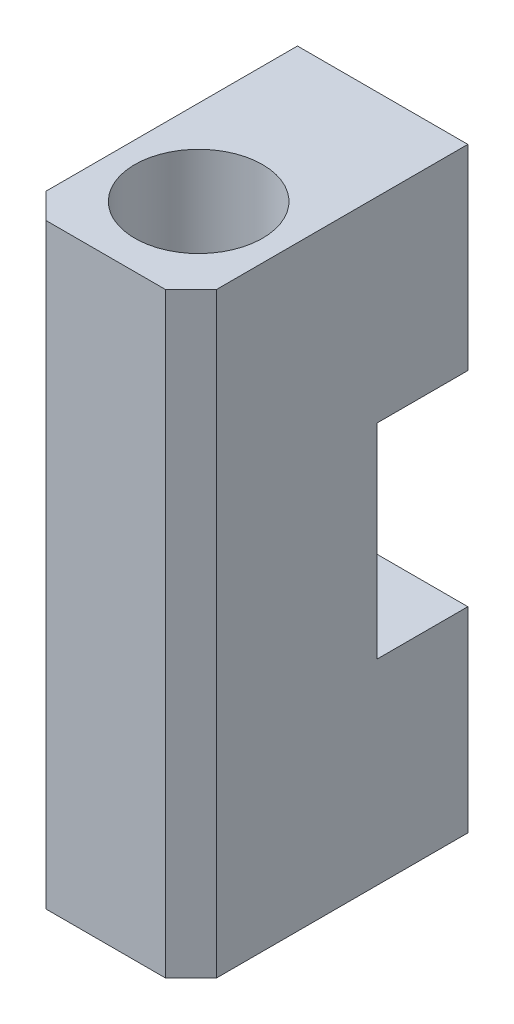
ISO-10303-21;
HEADER;
FILE_DESCRIPTION(('STEP AP214'),'2;1');
FILE_NAME('part.step','',(''),(''),'','','');
FILE_SCHEMA(('AUTOMOTIVE_DESIGN { 1 0 10303 214 1 1 1 1 }'));
ENDSEC;
DATA;
#1=APPLICATION_CONTEXT('core data for automotive mechanical design processes');
#2=APPLICATION_PROTOCOL_DEFINITION('international standard','automotive_design',2000,#1);
#3=PRODUCT_CONTEXT('',#1,'mechanical');
#4=PRODUCT('Part','Part','',(#3));
#5=PRODUCT_RELATED_PRODUCT_CATEGORY('part','',(#4));
#6=PRODUCT_DEFINITION_FORMATION('','',#4);
#7=PRODUCT_DEFINITION_CONTEXT('part definition',#1,'design');
#8=PRODUCT_DEFINITION('design','',#6,#7);
#9=PRODUCT_DEFINITION_SHAPE('','',#8);
#10=(LENGTH_UNIT() NAMED_UNIT(*) SI_UNIT(.MILLI.,.METRE.));
#11=(NAMED_UNIT(*) PLANE_ANGLE_UNIT() SI_UNIT($,.RADIAN.));
#12=(NAMED_UNIT(*) SI_UNIT($,.STERADIAN.) SOLID_ANGLE_UNIT());
#13=UNCERTAINTY_MEASURE_WITH_UNIT(LENGTH_MEASURE(1.E-05),#10,'distance_accuracy_value','');
#14=(GEOMETRIC_REPRESENTATION_CONTEXT(3) GLOBAL_UNCERTAINTY_ASSIGNED_CONTEXT((#13)) GLOBAL_UNIT_ASSIGNED_CONTEXT((#10,
#11,#12)) REPRESENTATION_CONTEXT('',''));
#15=CARTESIAN_POINT('',(0.,0.,0.));
#16=DIRECTION('',(0.,0.,1.));
#17=DIRECTION('',(1.,0.,0.));
#18=AXIS2_PLACEMENT_3D('',#15,#16,#17);
#19=CARTESIAN_POINT('',(0.,0.,-32.5));
#20=DIRECTION('',(0.,0.,-1.));
#21=DIRECTION('',(-1.,0.,0.));
#22=AXIS2_PLACEMENT_3D('',#19,#20,#21);
#23=PLANE('',#22);
#24=DIRECTION('',(1.,0.,0.));
#25=VECTOR('',#24,1.);
#26=CARTESIAN_POINT('',(0.,47.,-32.5));
#27=LINE('',#26,#25);
#28=CARTESIAN_POINT('',(0.,47.,-32.5));
#29=VERTEX_POINT('',#28);
#30=CARTESIAN_POINT('',(20.,47.,-32.5));
#31=VERTEX_POINT('',#30);
#32=EDGE_CURVE('E41',#29,#31,#27,.T.);
#33=ORIENTED_EDGE('',*,*,#32,.F.);
#34=DIRECTION('',(0.,-1.,0.));
#35=VECTOR('',#34,1.);
#36=CARTESIAN_POINT('',(0.,0.,-32.5));
#37=LINE('',#36,#35);
#38=CARTESIAN_POINT('',(0.,70.,-32.5));
#39=VERTEX_POINT('',#38);
#40=EDGE_CURVE('E140',#39,#29,#37,.T.);
#41=ORIENTED_EDGE('',*,*,#40,.F.);
#42=DIRECTION('',(-1.,0.,0.));
#43=VECTOR('',#42,1.);
#44=CARTESIAN_POINT('',(0.,70.,-32.5));
#45=LINE('',#44,#43);
#46=CARTESIAN_POINT('',(20.,70.,-32.5));
#47=VERTEX_POINT('',#46);
#48=EDGE_CURVE('E155',#47,#39,#45,.T.);
#49=ORIENTED_EDGE('',*,*,#48,.F.);
#50=DIRECTION('',(0.,1.,0.));
#51=VECTOR('',#50,1.);
#52=CARTESIAN_POINT('',(20.,0.,-32.5));
#53=LINE('',#52,#51);
#54=EDGE_CURVE('E152',#31,#47,#53,.T.);
#55=ORIENTED_EDGE('',*,*,#54,.F.);
#56=EDGE_LOOP('',(#33,#41,#49,#55));
#57=FACE_BOUND('',#56,.T.);
#58=CARTESIAN_POINT('',(10.,64.,-32.5));
#59=DIRECTION('',(0.,0.,-1.));
#60=DIRECTION('',(-1.,0.,0.));
#61=AXIS2_PLACEMENT_3D('',#58,#59,#60);
#62=CIRCLE('',#61,2.);
#63=CARTESIAN_POINT('',(8.00000000000001,64.,-32.5));
#64=VERTEX_POINT('',#63);
#65=EDGE_CURVE('E231',#64,#64,#62,.T.);
#66=ORIENTED_EDGE('',*,*,#65,.F.);
#67=EDGE_LOOP('',(#66));
#68=FACE_BOUND('',#67,.T.);
#69=ADVANCED_FACE('F33',(#57,#68),#23,.T.);
#70=CARTESIAN_POINT('',(0.,0.,-32.5));
#71=DIRECTION('',(-1.,0.,0.));
#72=DIRECTION('',(0.,0.,1.));
#73=AXIS2_PLACEMENT_3D('',#70,#71,#72);
#74=PLANE('',#73);
#75=DIRECTION('',(0.,0.,-1.));
#76=VECTOR('',#75,1.);
#77=CARTESIAN_POINT('',(0.,47.,-32.5));
#78=LINE('',#77,#76);
#79=CARTESIAN_POINT('',(0.,47.,-21.8540067878814));
#80=VERTEX_POINT('',#79);
#81=EDGE_CURVE('E192',#80,#29,#78,.T.);
#82=ORIENTED_EDGE('',*,*,#81,.F.);
#83=DIRECTION('',(0.,1.,0.));
#84=VECTOR('',#83,1.);
#85=CARTESIAN_POINT('',(0.,47.,-21.8540067878814));
#86=LINE('',#85,#84);
#87=CARTESIAN_POINT('',(0.,23.,-21.8540067878814));
#88=VERTEX_POINT('',#87);
#89=EDGE_CURVE('E133',#88,#80,#86,.T.);
#90=ORIENTED_EDGE('',*,*,#89,.F.);
#91=DIRECTION('',(0.,0.,1.));
#92=VECTOR('',#91,1.);
#93=CARTESIAN_POINT('',(0.,23.,-32.5));
#94=LINE('',#93,#92);
#95=CARTESIAN_POINT('',(0.,23.,-32.5));
#96=VERTEX_POINT('',#95);
#97=EDGE_CURVE('E118',#96,#88,#94,.T.);
#98=ORIENTED_EDGE('',*,*,#97,.F.);
#99=CARTESIAN_POINT('',(0.,0.,-32.5));
#100=VERTEX_POINT('',#99);
#101=EDGE_CURVE('E130',#96,#100,#37,.T.);
#102=ORIENTED_EDGE('',*,*,#101,.T.);
#103=DIRECTION('',(0.,0.,1.));
#104=VECTOR('',#103,1.);
#105=CARTESIAN_POINT('',(0.,0.,-32.5));
#106=LINE('',#105,#104);
#107=CARTESIAN_POINT('',(0.,0.,-3.00000000000002));
#108=VERTEX_POINT('',#107);
#109=EDGE_CURVE('E158',#100,#108,#106,.T.);
#110=ORIENTED_EDGE('',*,*,#109,.T.);
#111=DIRECTION('',(0.,1.,0.));
#112=VECTOR('',#111,1.);
#113=CARTESIAN_POINT('',(0.,70.,-3.00000000000002));
#114=LINE('',#113,#112);
#115=CARTESIAN_POINT('',(0.,70.,-3.00000000000002));
#116=VERTEX_POINT('',#115);
#117=EDGE_CURVE('E181',#108,#116,#114,.T.);
#118=ORIENTED_EDGE('',*,*,#117,.T.);
#119=DIRECTION('',(0.,0.,1.));
#120=VECTOR('',#119,1.);
#121=CARTESIAN_POINT('',(0.,70.,-32.5));
#122=LINE('',#121,#120);
#123=EDGE_CURVE('E162',#39,#116,#122,.T.);
#124=ORIENTED_EDGE('',*,*,#123,.F.);
#125=ORIENTED_EDGE('',*,*,#40,.T.);
#126=EDGE_LOOP('',(#82,#90,#98,#102,#110,#118,#124,#125));
#127=FACE_BOUND('',#126,.T.);
#128=ADVANCED_FACE('F128',(#127),#74,.T.);
#129=CARTESIAN_POINT('',(0.,70.,-32.5));
#130=DIRECTION('',(0.,1.,0.));
#131=DIRECTION('',(0.,0.,1.));
#132=AXIS2_PLACEMENT_3D('',#129,#130,#131);
#133=PLANE('',#132);
#134=CARTESIAN_POINT('',(10.,70.,-10.9));
#135=DIRECTION('',(0.,-1.,0.));
#136=DIRECTION('',(0.,0.,-1.));
#137=AXIS2_PLACEMENT_3D('',#134,#135,#136);
#138=CIRCLE('',#137,7.49999999999999);
#139=CARTESIAN_POINT('',(10.,70.,-18.4));
#140=VERTEX_POINT('',#139);
#141=EDGE_CURVE('E160',#140,#140,#138,.T.);
#142=ORIENTED_EDGE('',*,*,#141,.T.);
#143=EDGE_LOOP('',(#142));
#144=FACE_BOUND('',#143,.T.);
#145=ORIENTED_EDGE('',*,*,#123,.T.);
#146=DIRECTION('',(0.707106781186547,0.,0.707106781186548));
#147=VECTOR('',#146,1.);
#148=CARTESIAN_POINT('',(-14.75,70.,-17.75));
#149=LINE('',#148,#147);
#150=CARTESIAN_POINT('',(3.00000000000001,70.,0.));
#151=VERTEX_POINT('',#150);
#152=EDGE_CURVE('E184',#116,#151,#149,.T.);
#153=ORIENTED_EDGE('',*,*,#152,.T.);
#154=DIRECTION('',(-1.,0.,0.));
#155=VECTOR('',#154,1.);
#156=CARTESIAN_POINT('',(0.,70.,0.));
#157=LINE('',#156,#155);
#158=CARTESIAN_POINT('',(17.,70.,0.));
#159=VERTEX_POINT('',#158);
#160=EDGE_CURVE('E141',#159,#151,#157,.T.);
#161=ORIENTED_EDGE('',*,*,#160,.F.);
#162=DIRECTION('',(0.707106781186547,0.,-0.707106781186548));
#163=VECTOR('',#162,1.);
#164=CARTESIAN_POINT('',(24.75,70.,-7.75000000000005));
#165=LINE('',#164,#163);
#166=CARTESIAN_POINT('',(20.,70.,-3.00000000000002));
#167=VERTEX_POINT('',#166);
#168=EDGE_CURVE('E56',#159,#167,#165,.T.);
#169=ORIENTED_EDGE('',*,*,#168,.T.);
#170=DIRECTION('',(0.,0.,1.));
#171=VECTOR('',#170,1.);
#172=CARTESIAN_POINT('',(20.,70.,-32.5));
#173=LINE('',#172,#171);
#174=EDGE_CURVE('E166',#47,#167,#173,.T.);
#175=ORIENTED_EDGE('',*,*,#174,.F.);
#176=ORIENTED_EDGE('',*,*,#48,.T.);
#177=EDGE_LOOP('',(#145,#153,#161,#169,#175,#176));
#178=FACE_BOUND('',#177,.T.);
#179=ADVANCED_FACE('F203',(#144,#178),#133,.T.);
#180=CARTESIAN_POINT('',(20.,0.,-32.5));
#181=DIRECTION('',(1.,0.,0.));
#182=DIRECTION('',(0.,0.,-1.));
#183=AXIS2_PLACEMENT_3D('',#180,#181,#182);
#184=PLANE('',#183);
#185=DIRECTION('',(0.,0.,1.));
#186=VECTOR('',#185,1.);
#187=CARTESIAN_POINT('',(20.,47.,-32.5));
#188=LINE('',#187,#186);
#189=CARTESIAN_POINT('',(20.,47.,-21.8540067878814));
#190=VERTEX_POINT('',#189);
#191=EDGE_CURVE('E190',#31,#190,#188,.T.);
#192=ORIENTED_EDGE('',*,*,#191,.F.);
#193=ORIENTED_EDGE('',*,*,#54,.T.);
#194=ORIENTED_EDGE('',*,*,#174,.T.);
#195=DIRECTION('',(0.,-1.,0.));
#196=VECTOR('',#195,1.);
#197=CARTESIAN_POINT('',(20.,0.,-3.00000000000002));
#198=LINE('',#197,#196);
#199=CARTESIAN_POINT('',(20.,0.,-3.00000000000002));
#200=VERTEX_POINT('',#199);
#201=EDGE_CURVE('E124',#167,#200,#198,.T.);
#202=ORIENTED_EDGE('',*,*,#201,.T.);
#203=DIRECTION('',(0.,0.,1.));
#204=VECTOR('',#203,1.);
#205=CARTESIAN_POINT('',(20.,0.,-32.5));
#206=LINE('',#205,#204);
#207=CARTESIAN_POINT('',(20.,0.,-32.5));
#208=VERTEX_POINT('',#207);
#209=EDGE_CURVE('E168',#208,#200,#206,.T.);
#210=ORIENTED_EDGE('',*,*,#209,.F.);
#211=CARTESIAN_POINT('',(20.,23.,-32.5));
#212=VERTEX_POINT('',#211);
#213=EDGE_CURVE('E153',#208,#212,#53,.T.);
#214=ORIENTED_EDGE('',*,*,#213,.T.);
#215=DIRECTION('',(0.,0.,-1.));
#216=VECTOR('',#215,1.);
#217=CARTESIAN_POINT('',(20.,23.,-32.5));
#218=LINE('',#217,#216);
#219=CARTESIAN_POINT('',(20.,23.,-21.8540067878814));
#220=VERTEX_POINT('',#219);
#221=EDGE_CURVE('E48',#220,#212,#218,.T.);
#222=ORIENTED_EDGE('',*,*,#221,.F.);
#223=DIRECTION('',(0.,-1.,0.));
#224=VECTOR('',#223,1.);
#225=CARTESIAN_POINT('',(20.,0.,-21.8540067878814));
#226=LINE('',#225,#224);
#227=EDGE_CURVE('E11',#190,#220,#226,.T.);
#228=ORIENTED_EDGE('',*,*,#227,.F.);
#229=EDGE_LOOP('',(#192,#193,#194,#202,#210,#214,#222,#228));
#230=FACE_BOUND('',#229,.T.);
#231=ADVANCED_FACE('F198',(#230),#184,.T.);
#232=CARTESIAN_POINT('',(0.,0.,-32.5));
#233=DIRECTION('',(0.,-1.,0.));
#234=DIRECTION('',(0.,0.,-1.));
#235=AXIS2_PLACEMENT_3D('',#232,#233,#234);
#236=PLANE('',#235);
#237=CARTESIAN_POINT('',(10.,0.,-10.9));
#238=DIRECTION('',(0.,-1.,0.));
#239=DIRECTION('',(0.,0.,-1.));
#240=AXIS2_PLACEMENT_3D('',#237,#238,#239);
#241=CIRCLE('',#240,7.49999999999999);
#242=CARTESIAN_POINT('',(10.,0.,-18.4));
#243=VERTEX_POINT('',#242);
#244=EDGE_CURVE('E149',#243,#243,#241,.T.);
#245=ORIENTED_EDGE('',*,*,#244,.F.);
#246=EDGE_LOOP('',(#245));
#247=FACE_BOUND('',#246,.T.);
#248=DIRECTION('',(1.,0.,0.));
#249=VECTOR('',#248,1.);
#250=CARTESIAN_POINT('',(0.,0.,0.));
#251=LINE('',#250,#249);
#252=CARTESIAN_POINT('',(3.00000000000001,0.,0.));
#253=VERTEX_POINT('',#252);
#254=CARTESIAN_POINT('',(17.,0.,0.));
#255=VERTEX_POINT('',#254);
#256=EDGE_CURVE('E145',#253,#255,#251,.T.);
#257=ORIENTED_EDGE('',*,*,#256,.F.);
#258=DIRECTION('',(-0.707106781186547,0.,-0.707106781186548));
#259=VECTOR('',#258,1.);
#260=CARTESIAN_POINT('',(-14.75,0.,-17.75));
#261=LINE('',#260,#259);
#262=EDGE_CURVE('E179',#253,#108,#261,.T.);
#263=ORIENTED_EDGE('',*,*,#262,.T.);
#264=ORIENTED_EDGE('',*,*,#109,.F.);
#265=DIRECTION('',(1.,0.,0.));
#266=VECTOR('',#265,1.);
#267=CARTESIAN_POINT('',(0.,0.,-32.5));
#268=LINE('',#267,#266);
#269=EDGE_CURVE('E139',#100,#208,#268,.T.);
#270=ORIENTED_EDGE('',*,*,#269,.T.);
#271=ORIENTED_EDGE('',*,*,#209,.T.);
#272=DIRECTION('',(-0.707106781186547,0.,0.707106781186548));
#273=VECTOR('',#272,1.);
#274=CARTESIAN_POINT('',(24.75,0.,-7.75000000000005));
#275=LINE('',#274,#273);
#276=EDGE_CURVE('E177',#200,#255,#275,.T.);
#277=ORIENTED_EDGE('',*,*,#276,.T.);
#278=EDGE_LOOP('',(#257,#263,#264,#270,#271,#277));
#279=FACE_BOUND('',#278,.T.);
#280=ADVANCED_FACE('F211',(#247,#279),#236,.T.);
#281=DIRECTION('',(-1.,0.,0.));
#282=VECTOR('',#281,1.);
#283=CARTESIAN_POINT('',(0.,23.,-32.5));
#284=LINE('',#283,#282);
#285=EDGE_CURVE('E115',#212,#96,#284,.T.);
#286=ORIENTED_EDGE('',*,*,#285,.F.);
#287=ORIENTED_EDGE('',*,*,#213,.F.);
#288=ORIENTED_EDGE('',*,*,#269,.F.);
#289=ORIENTED_EDGE('',*,*,#101,.F.);
#290=EDGE_LOOP('',(#286,#287,#288,#289));
#291=FACE_BOUND('',#290,.T.);
#292=CARTESIAN_POINT('',(10.,6.,-32.5));
#293=DIRECTION('',(0.,0.,-1.));
#294=DIRECTION('',(-1.,0.,0.));
#295=AXIS2_PLACEMENT_3D('',#292,#293,#294);
#296=CIRCLE('',#295,2.);
#297=CARTESIAN_POINT('',(8.,6.,-32.5));
#298=VERTEX_POINT('',#297);
#299=EDGE_CURVE('E199',#298,#298,#296,.T.);
#300=ORIENTED_EDGE('',*,*,#299,.F.);
#301=EDGE_LOOP('',(#300));
#302=FACE_BOUND('',#301,.T.);
#303=ADVANCED_FACE('F136',(#291,#302),#23,.T.);
#304=CARTESIAN_POINT('',(0.,0.,0.));
#305=DIRECTION('',(0.,0.,-1.));
#306=DIRECTION('',(-1.,0.,0.));
#307=AXIS2_PLACEMENT_3D('',#304,#305,#306);
#308=PLANE('',#307);
#309=ORIENTED_EDGE('',*,*,#160,.T.);
#310=DIRECTION('',(0.,-1.,0.));
#311=VECTOR('',#310,1.);
#312=CARTESIAN_POINT('',(3.00000000000001,0.,0.));
#313=LINE('',#312,#311);
#314=EDGE_CURVE('E174',#151,#253,#313,.T.);
#315=ORIENTED_EDGE('',*,*,#314,.T.);
#316=ORIENTED_EDGE('',*,*,#256,.T.);
#317=DIRECTION('',(0.,1.,0.));
#318=VECTOR('',#317,1.);
#319=CARTESIAN_POINT('',(17.,70.,0.));
#320=LINE('',#319,#318);
#321=EDGE_CURVE('E165',#255,#159,#320,.T.);
#322=ORIENTED_EDGE('',*,*,#321,.T.);
#323=EDGE_LOOP('',(#309,#315,#316,#322));
#324=FACE_BOUND('',#323,.T.);
#325=ADVANCED_FACE('F213',(#324),#308,.F.);
#326=CARTESIAN_POINT('',(10.,70.,-10.9));
#327=DIRECTION('',(0.,-1.,0.));
#328=DIRECTION('',(0.,0.,-1.));
#329=AXIS2_PLACEMENT_3D('',#326,#327,#328);
#330=CYLINDRICAL_SURFACE('',#329,7.49999999999999);
#331=ORIENTED_EDGE('',*,*,#141,.F.);
#332=EDGE_LOOP('',(#331));
#333=FACE_BOUND('',#332,.T.);
#334=ORIENTED_EDGE('',*,*,#244,.T.);
#335=EDGE_LOOP('',(#334));
#336=FACE_BOUND('',#335,.T.);
#337=ADVANCED_FACE('F242',(#333,#336),#330,.F.);
#338=CARTESIAN_POINT('',(10.,64.,-22.5));
#339=DIRECTION('',(0.,0.,-1.));
#340=DIRECTION('',(-1.,0.,0.));
#341=AXIS2_PLACEMENT_3D('',#338,#339,#340);
#342=CONICAL_SURFACE('',#341,2.,1.02974425867665);
#343=CARTESIAN_POINT('',(10.,64.,-21.2982787619449));
#344=VERTEX_POINT('',#343);
#345=VERTEX_LOOP('',#344);
#346=FACE_BOUND('',#345,.T.);
#347=CARTESIAN_POINT('',(10.,64.,-22.5));
#348=DIRECTION('',(0.,0.,-1.));
#349=DIRECTION('',(-1.,0.,0.));
#350=AXIS2_PLACEMENT_3D('',#347,#348,#349);
#351=CIRCLE('',#350,2.);
#352=CARTESIAN_POINT('',(8.00000000000001,64.,-22.5));
#353=VERTEX_POINT('',#352);
#354=EDGE_CURVE('E234',#353,#353,#351,.T.);
#355=ORIENTED_EDGE('',*,*,#354,.T.);
#356=EDGE_LOOP('',(#355));
#357=FACE_BOUND('',#356,.T.);
#358=ADVANCED_FACE('F325',(#346,#357),#342,.F.);
#359=CARTESIAN_POINT('',(10.,64.,-32.5));
#360=DIRECTION('',(0.,0.,-1.));
#361=DIRECTION('',(-1.,0.,0.));
#362=AXIS2_PLACEMENT_3D('',#359,#360,#361);
#363=CYLINDRICAL_SURFACE('',#362,2.);
#364=ORIENTED_EDGE('',*,*,#354,.F.);
#365=EDGE_LOOP('',(#364));
#366=FACE_BOUND('',#365,.T.);
#367=ORIENTED_EDGE('',*,*,#65,.T.);
#368=EDGE_LOOP('',(#367));
#369=FACE_BOUND('',#368,.T.);
#370=ADVANCED_FACE('F322',(#366,#369),#363,.F.);
#371=CARTESIAN_POINT('',(10.,6.,-22.5));
#372=DIRECTION('',(0.,0.,-1.));
#373=DIRECTION('',(-1.,0.,0.));
#374=AXIS2_PLACEMENT_3D('',#371,#372,#373);
#375=CONICAL_SURFACE('',#374,2.,1.02974425867665);
#376=CARTESIAN_POINT('',(10.,6.,-21.2982787619449));
#377=VERTEX_POINT('',#376);
#378=VERTEX_LOOP('',#377);
#379=FACE_BOUND('',#378,.T.);
#380=CARTESIAN_POINT('',(10.,6.,-22.5));
#381=DIRECTION('',(0.,0.,-1.));
#382=DIRECTION('',(-1.,0.,0.));
#383=AXIS2_PLACEMENT_3D('',#380,#381,#382);
#384=CIRCLE('',#383,2.);
#385=CARTESIAN_POINT('',(8.,6.,-22.5));
#386=VERTEX_POINT('',#385);
#387=EDGE_CURVE('E228',#386,#386,#384,.T.);
#388=ORIENTED_EDGE('',*,*,#387,.T.);
#389=EDGE_LOOP('',(#388));
#390=FACE_BOUND('',#389,.T.);
#391=ADVANCED_FACE('F318',(#379,#390),#375,.F.);
#392=CARTESIAN_POINT('',(10.,6.,-32.5));
#393=DIRECTION('',(0.,0.,-1.));
#394=DIRECTION('',(-1.,0.,0.));
#395=AXIS2_PLACEMENT_3D('',#392,#393,#394);
#396=CYLINDRICAL_SURFACE('',#395,2.);
#397=ORIENTED_EDGE('',*,*,#387,.F.);
#398=EDGE_LOOP('',(#397));
#399=FACE_BOUND('',#398,.T.);
#400=ORIENTED_EDGE('',*,*,#299,.T.);
#401=EDGE_LOOP('',(#400));
#402=FACE_BOUND('',#401,.T.);
#403=ADVANCED_FACE('F315',(#399,#402),#396,.F.);
#404=CARTESIAN_POINT('',(3.00000000000001,0.,0.));
#405=DIRECTION('',(-0.707106781186548,0.,0.707106781186547));
#406=DIRECTION('',(0.,1.,0.));
#407=AXIS2_PLACEMENT_3D('',#404,#405,#406);
#408=PLANE('',#407);
#409=ORIENTED_EDGE('',*,*,#152,.F.);
#410=ORIENTED_EDGE('',*,*,#117,.F.);
#411=ORIENTED_EDGE('',*,*,#262,.F.);
#412=ORIENTED_EDGE('',*,*,#314,.F.);
#413=EDGE_LOOP('',(#409,#410,#411,#412));
#414=FACE_BOUND('',#413,.T.);
#415=ADVANCED_FACE('F216',(#414),#408,.T.);
#416=CARTESIAN_POINT('',(17.,0.,0.));
#417=DIRECTION('',(0.707106781186548,0.,0.707106781186547));
#418=DIRECTION('',(0.,-1.,0.));
#419=AXIS2_PLACEMENT_3D('',#416,#417,#418);
#420=PLANE('',#419);
#421=ORIENTED_EDGE('',*,*,#276,.F.);
#422=ORIENTED_EDGE('',*,*,#201,.F.);
#423=ORIENTED_EDGE('',*,*,#168,.F.);
#424=ORIENTED_EDGE('',*,*,#321,.F.);
#425=EDGE_LOOP('',(#421,#422,#423,#424));
#426=FACE_BOUND('',#425,.T.);
#427=ADVANCED_FACE('F35',(#426),#420,.T.);
#428=CARTESIAN_POINT('',(26.,47.,-32.5));
#429=DIRECTION('',(0.,1.,0.));
#430=DIRECTION('',(0.,0.,1.));
#431=AXIS2_PLACEMENT_3D('',#428,#429,#430);
#432=PLANE('',#431);
#433=ORIENTED_EDGE('',*,*,#191,.T.);
#434=DIRECTION('',(-1.,0.,0.));
#435=VECTOR('',#434,1.);
#436=CARTESIAN_POINT('',(26.,47.,-21.8540067878814));
#437=LINE('',#436,#435);
#438=EDGE_CURVE('E220',#190,#80,#437,.T.);
#439=ORIENTED_EDGE('',*,*,#438,.T.);
#440=ORIENTED_EDGE('',*,*,#81,.T.);
#441=ORIENTED_EDGE('',*,*,#32,.T.);
#442=EDGE_LOOP('',(#433,#439,#440,#441));
#443=FACE_BOUND('',#442,.T.);
#444=ADVANCED_FACE('F189',(#443),#432,.F.);
#445=CARTESIAN_POINT('',(26.,47.,-21.8540067878814));
#446=DIRECTION('',(0.,0.,1.));
#447=DIRECTION('',(1.,0.,0.));
#448=AXIS2_PLACEMENT_3D('',#445,#446,#447);
#449=PLANE('',#448);
#450=ORIENTED_EDGE('',*,*,#227,.T.);
#451=DIRECTION('',(-1.,0.,0.));
#452=VECTOR('',#451,1.);
#453=CARTESIAN_POINT('',(26.,23.,-21.8540067878814));
#454=LINE('',#453,#452);
#455=EDGE_CURVE('E218',#220,#88,#454,.T.);
#456=ORIENTED_EDGE('',*,*,#455,.T.);
#457=ORIENTED_EDGE('',*,*,#89,.T.);
#458=ORIENTED_EDGE('',*,*,#438,.F.);
#459=EDGE_LOOP('',(#450,#456,#457,#458));
#460=FACE_BOUND('',#459,.T.);
#461=ADVANCED_FACE('F291',(#460),#449,.F.);
#462=CARTESIAN_POINT('',(26.,23.,-32.5));
#463=DIRECTION('',(0.,-1.,0.));
#464=DIRECTION('',(0.,0.,-1.));
#465=AXIS2_PLACEMENT_3D('',#462,#463,#464);
#466=PLANE('',#465);
#467=ORIENTED_EDGE('',*,*,#221,.T.);
#468=ORIENTED_EDGE('',*,*,#285,.T.);
#469=ORIENTED_EDGE('',*,*,#97,.T.);
#470=ORIENTED_EDGE('',*,*,#455,.F.);
#471=EDGE_LOOP('',(#467,#468,#469,#470));
#472=FACE_BOUND('',#471,.T.);
#473=ADVANCED_FACE('F117',(#472),#466,.F.);
#474=CLOSED_SHELL('',(#69,#128,#179,#231,#280,#303,#325,#337,#358,#370,#391,#403,#415,#427,#444,
#461,#473));
#475=MANIFOLD_SOLID_BREP('B2',#474);
#476=ADVANCED_BREP_SHAPE_REPRESENTATION('',(#18,#475),#14);
#477=SHAPE_DEFINITION_REPRESENTATION(#9,#476);
ENDSEC;
END-ISO-10303-21;
